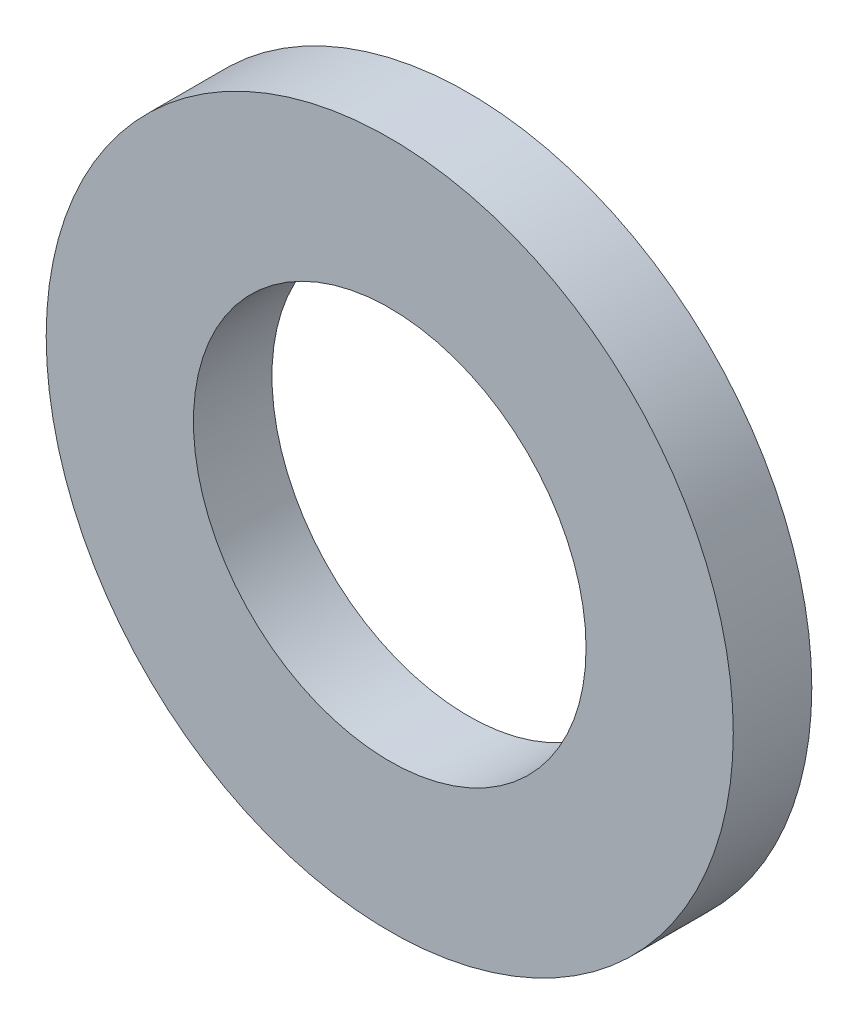
ISO-10303-21;
HEADER;
FILE_DESCRIPTION(('STEP AP214'),'2;1');
FILE_NAME('part.step','',(''),(''),'','','');
FILE_SCHEMA(('AUTOMOTIVE_DESIGN { 1 0 10303 214 1 1 1 1 }'));
ENDSEC;
DATA;
#1=APPLICATION_CONTEXT('core data for automotive mechanical design processes');
#2=APPLICATION_PROTOCOL_DEFINITION('international standard','automotive_design',2000,#1);
#3=PRODUCT_CONTEXT('',#1,'mechanical');
#4=PRODUCT('Part','Part','',(#3));
#5=PRODUCT_RELATED_PRODUCT_CATEGORY('part','',(#4));
#6=PRODUCT_DEFINITION_FORMATION('','',#4);
#7=PRODUCT_DEFINITION_CONTEXT('part definition',#1,'design');
#8=PRODUCT_DEFINITION('design','',#6,#7);
#9=PRODUCT_DEFINITION_SHAPE('','',#8);
#10=(LENGTH_UNIT() NAMED_UNIT(*) SI_UNIT(.MILLI.,.METRE.));
#11=(NAMED_UNIT(*) PLANE_ANGLE_UNIT() SI_UNIT($,.RADIAN.));
#12=(NAMED_UNIT(*) SI_UNIT($,.STERADIAN.) SOLID_ANGLE_UNIT());
#13=UNCERTAINTY_MEASURE_WITH_UNIT(LENGTH_MEASURE(1.E-05),#10,'distance_accuracy_value','');
#14=(GEOMETRIC_REPRESENTATION_CONTEXT(3) GLOBAL_UNCERTAINTY_ASSIGNED_CONTEXT((#13)) GLOBAL_UNIT_ASSIGNED_CONTEXT((#10,
#11,#12)) REPRESENTATION_CONTEXT('',''));
#15=CARTESIAN_POINT('',(0.,0.,0.));
#16=DIRECTION('',(0.,0.,1.));
#17=DIRECTION('',(1.,0.,0.));
#18=AXIS2_PLACEMENT_3D('',#15,#16,#17);
#19=CARTESIAN_POINT('',(0.,0.,4.));
#20=DIRECTION('',(0.,0.,1.));
#21=DIRECTION('',(1.,0.,0.));
#22=AXIS2_PLACEMENT_3D('',#19,#20,#21);
#23=PLANE('',#22);
#24=CARTESIAN_POINT('',(0.,0.,4.));
#25=DIRECTION('',(0.,0.,1.));
#26=DIRECTION('',(1.,0.,0.));
#27=AXIS2_PLACEMENT_3D('',#24,#25,#26);
#28=CIRCLE('',#27,17.5);
#29=CARTESIAN_POINT('',(17.5,0.,4.));
#30=VERTEX_POINT('',#29);
#31=EDGE_CURVE('E10',#30,#30,#28,.T.);
#32=ORIENTED_EDGE('',*,*,#31,.T.);
#33=EDGE_LOOP('',(#32));
#34=FACE_BOUND('',#33,.T.);
#35=CARTESIAN_POINT('',(0.,0.,4.));
#36=DIRECTION('',(0.,0.,1.));
#37=DIRECTION('',(1.,0.,0.));
#38=AXIS2_PLACEMENT_3D('',#35,#36,#37);
#39=CIRCLE('',#38,10.);
#40=CARTESIAN_POINT('',(10.,0.,4.));
#41=VERTEX_POINT('',#40);
#42=EDGE_CURVE('E50',#41,#41,#39,.T.);
#43=ORIENTED_EDGE('',*,*,#42,.F.);
#44=EDGE_LOOP('',(#43));
#45=FACE_BOUND('',#44,.T.);
#46=ADVANCED_FACE('F37',(#34,#45),#23,.T.);
#47=CARTESIAN_POINT('',(0.,0.,0.));
#48=DIRECTION('',(0.,0.,1.));
#49=DIRECTION('',(1.,0.,0.));
#50=AXIS2_PLACEMENT_3D('',#47,#48,#49);
#51=PLANE('',#50);
#52=CARTESIAN_POINT('',(0.,0.,0.));
#53=DIRECTION('',(0.,0.,1.));
#54=DIRECTION('',(1.,0.,0.));
#55=AXIS2_PLACEMENT_3D('',#52,#53,#54);
#56=CIRCLE('',#55,17.5);
#57=CARTESIAN_POINT('',(17.5,0.,0.));
#58=VERTEX_POINT('',#57);
#59=EDGE_CURVE('E41',#58,#58,#56,.T.);
#60=ORIENTED_EDGE('',*,*,#59,.F.);
#61=EDGE_LOOP('',(#60));
#62=FACE_BOUND('',#61,.T.);
#63=CARTESIAN_POINT('',(0.,0.,0.));
#64=DIRECTION('',(0.,0.,1.));
#65=DIRECTION('',(1.,0.,0.));
#66=AXIS2_PLACEMENT_3D('',#63,#64,#65);
#67=CIRCLE('',#66,10.);
#68=CARTESIAN_POINT('',(10.,0.,0.));
#69=VERTEX_POINT('',#68);
#70=EDGE_CURVE('E52',#69,#69,#67,.T.);
#71=ORIENTED_EDGE('',*,*,#70,.T.);
#72=EDGE_LOOP('',(#71));
#73=FACE_BOUND('',#72,.T.);
#74=ADVANCED_FACE('F64',(#62,#73),#51,.F.);
#75=CARTESIAN_POINT('',(0.,0.,4.));
#76=DIRECTION('',(0.,0.,-1.));
#77=DIRECTION('',(-1.,0.,0.));
#78=AXIS2_PLACEMENT_3D('',#75,#76,#77);
#79=CYLINDRICAL_SURFACE('',#78,17.5);
#80=ORIENTED_EDGE('',*,*,#31,.F.);
#81=EDGE_LOOP('',(#80));
#82=FACE_BOUND('',#81,.T.);
#83=ORIENTED_EDGE('',*,*,#59,.T.);
#84=EDGE_LOOP('',(#83));
#85=FACE_BOUND('',#84,.T.);
#86=ADVANCED_FACE('F39',(#82,#85),#79,.T.);
#87=CARTESIAN_POINT('',(0.,0.,4.));
#88=DIRECTION('',(0.,0.,-1.));
#89=DIRECTION('',(-1.,0.,0.));
#90=AXIS2_PLACEMENT_3D('',#87,#88,#89);
#91=CYLINDRICAL_SURFACE('',#90,10.);
#92=ORIENTED_EDGE('',*,*,#42,.T.);
#93=EDGE_LOOP('',(#92));
#94=FACE_BOUND('',#93,.T.);
#95=ORIENTED_EDGE('',*,*,#70,.F.);
#96=EDGE_LOOP('',(#95));
#97=FACE_BOUND('',#96,.T.);
#98=ADVANCED_FACE('F60',(#94,#97),#91,.F.);
#99=CLOSED_SHELL('',(#46,#74,#86,#98));
#100=MANIFOLD_SOLID_BREP('B2',#99);
#101=ADVANCED_BREP_SHAPE_REPRESENTATION('',(#18,#100),#14);
#102=SHAPE_DEFINITION_REPRESENTATION(#9,#101);
ENDSEC;
END-ISO-10303-21;
